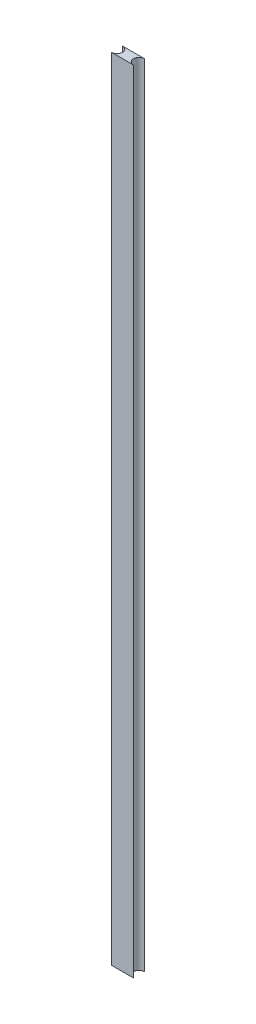
ISO-10303-21;
HEADER;
FILE_DESCRIPTION(('STEP AP214'),'2;1');
FILE_NAME('part.step','',(''),(''),'','','');
FILE_SCHEMA(('AUTOMOTIVE_DESIGN { 1 0 10303 214 1 1 1 1 }'));
ENDSEC;
DATA;
#1=APPLICATION_CONTEXT('core data for automotive mechanical design processes');
#2=APPLICATION_PROTOCOL_DEFINITION('international standard','automotive_design',2000,#1);
#3=PRODUCT_CONTEXT('',#1,'mechanical');
#4=PRODUCT('Part','Part','',(#3));
#5=PRODUCT_RELATED_PRODUCT_CATEGORY('part','',(#4));
#6=PRODUCT_DEFINITION_FORMATION('','',#4);
#7=PRODUCT_DEFINITION_CONTEXT('part definition',#1,'design');
#8=PRODUCT_DEFINITION('design','',#6,#7);
#9=PRODUCT_DEFINITION_SHAPE('','',#8);
#10=(LENGTH_UNIT() NAMED_UNIT(*) SI_UNIT(.MILLI.,.METRE.));
#11=(NAMED_UNIT(*) PLANE_ANGLE_UNIT() SI_UNIT($,.RADIAN.));
#12=(NAMED_UNIT(*) SI_UNIT($,.STERADIAN.) SOLID_ANGLE_UNIT());
#13=UNCERTAINTY_MEASURE_WITH_UNIT(LENGTH_MEASURE(1.E-05),#10,'distance_accuracy_value','');
#14=(GEOMETRIC_REPRESENTATION_CONTEXT(3) GLOBAL_UNCERTAINTY_ASSIGNED_CONTEXT((#13)) GLOBAL_UNIT_ASSIGNED_CONTEXT((#10,
#11,#12)) REPRESENTATION_CONTEXT('',''));
#15=CARTESIAN_POINT('',(0.,0.,0.));
#16=DIRECTION('',(0.,0.,1.));
#17=DIRECTION('',(1.,0.,0.));
#18=AXIS2_PLACEMENT_3D('',#15,#16,#17);
#19=CARTESIAN_POINT('',(-44.5716872313853,1800.,204.139724876424));
#20=DIRECTION('',(0.,-1.,0.));
#21=DIRECTION('',(0.,0.,-1.));
#22=AXIS2_PLACEMENT_3D('',#19,#20,#21);
#23=CYLINDRICAL_SURFACE('',#22,12.5);
#24=CARTESIAN_POINT('',(-44.5716872313853,0.,204.139724876424));
#25=DIRECTION('',(0.,-1.,0.));
#26=DIRECTION('',(0.,0.,1.));
#27=AXIS2_PLACEMENT_3D('',#24,#25,#26);
#28=CIRCLE('',#27,12.5);
#29=CARTESIAN_POINT('',(-44.5716872313853,0.,191.639724876424));
#30=VERTEX_POINT('',#29);
#31=CARTESIAN_POINT('',(-44.5716872313853,0.,216.639724876423));
#32=VERTEX_POINT('',#31);
#33=EDGE_CURVE('E96',#30,#32,#28,.T.);
#34=ORIENTED_EDGE('',*,*,#33,.T.);
#35=DIRECTION('',(0.,-1.,0.));
#36=VECTOR('',#35,1.);
#37=CARTESIAN_POINT('',(-44.5716872313853,1800.,216.639724876423));
#38=LINE('',#37,#36);
#39=CARTESIAN_POINT('',(-44.5716872313853,1800.,216.639724876423));
#40=VERTEX_POINT('',#39);
#41=EDGE_CURVE('E11',#40,#32,#38,.T.);
#42=ORIENTED_EDGE('',*,*,#41,.F.);
#43=CARTESIAN_POINT('',(-44.5716872313853,1800.,204.139724876424));
#44=DIRECTION('',(0.,-1.,0.));
#45=DIRECTION('',(0.,0.,1.));
#46=AXIS2_PLACEMENT_3D('',#43,#44,#45);
#47=CIRCLE('',#46,12.5);
#48=CARTESIAN_POINT('',(-44.5716872313853,1800.,191.639724876424));
#49=VERTEX_POINT('',#48);
#50=EDGE_CURVE('E84',#49,#40,#47,.T.);
#51=ORIENTED_EDGE('',*,*,#50,.F.);
#52=DIRECTION('',(0.,-1.,0.));
#53=VECTOR('',#52,1.);
#54=CARTESIAN_POINT('',(-44.5716872313853,1800.,191.639724876424));
#55=LINE('',#54,#53);
#56=EDGE_CURVE('E92',#49,#30,#55,.T.);
#57=ORIENTED_EDGE('',*,*,#56,.T.);
#58=EDGE_LOOP('',(#34,#42,#51,#57));
#59=FACE_BOUND('',#58,.T.);
#60=ADVANCED_FACE('F33',(#59),#23,.F.);
#61=CARTESIAN_POINT('',(-44.5716872313853,1800.,216.639724876423));
#62=DIRECTION('',(0.,0.,-1.));
#63=DIRECTION('',(-1.,0.,0.));
#64=AXIS2_PLACEMENT_3D('',#61,#62,#63);
#65=PLANE('',#64);
#66=DIRECTION('',(1.,0.,0.));
#67=VECTOR('',#66,1.);
#68=CARTESIAN_POINT('',(-44.5716872313853,0.,216.639724876423));
#69=LINE('',#68,#67);
#70=CARTESIAN_POINT('',(5.42831276861472,0.,216.639724876424));
#71=VERTEX_POINT('',#70);
#72=EDGE_CURVE('E88',#32,#71,#69,.T.);
#73=ORIENTED_EDGE('',*,*,#72,.T.);
#74=DIRECTION('',(0.,-1.,0.));
#75=VECTOR('',#74,1.);
#76=CARTESIAN_POINT('',(5.42831276861472,1800.,216.639724876424));
#77=LINE('',#76,#75);
#78=CARTESIAN_POINT('',(5.42831276861472,1800.,216.639724876424));
#79=VERTEX_POINT('',#78);
#80=EDGE_CURVE('E41',#79,#71,#77,.T.);
#81=ORIENTED_EDGE('',*,*,#80,.F.);
#82=DIRECTION('',(1.,0.,0.));
#83=VECTOR('',#82,1.);
#84=CARTESIAN_POINT('',(-44.5716872313853,1800.,216.639724876423));
#85=LINE('',#84,#83);
#86=EDGE_CURVE('E79',#40,#79,#85,.T.);
#87=ORIENTED_EDGE('',*,*,#86,.F.);
#88=ORIENTED_EDGE('',*,*,#41,.T.);
#89=EDGE_LOOP('',(#73,#81,#87,#88));
#90=FACE_BOUND('',#89,.T.);
#91=ADVANCED_FACE('F87',(#90),#65,.F.);
#92=CARTESIAN_POINT('',(5.42831276861472,1800.,204.139724876424));
#93=DIRECTION('',(0.,-1.,0.));
#94=DIRECTION('',(0.,0.,-1.));
#95=AXIS2_PLACEMENT_3D('',#92,#93,#94);
#96=CYLINDRICAL_SURFACE('',#95,12.5);
#97=CARTESIAN_POINT('',(5.42831276861472,0.,204.139724876424));
#98=DIRECTION('',(0.,-1.,0.));
#99=DIRECTION('',(0.,0.,1.));
#100=AXIS2_PLACEMENT_3D('',#97,#98,#99);
#101=CIRCLE('',#100,12.5);
#102=CARTESIAN_POINT('',(5.42831276861471,0.,191.639724876424));
#103=VERTEX_POINT('',#102);
#104=EDGE_CURVE('E66',#71,#103,#101,.T.);
#105=ORIENTED_EDGE('',*,*,#104,.T.);
#106=DIRECTION('',(0.,-1.,0.));
#107=VECTOR('',#106,1.);
#108=CARTESIAN_POINT('',(5.42831276861471,1800.,191.639724876424));
#109=LINE('',#108,#107);
#110=CARTESIAN_POINT('',(5.42831276861471,1800.,191.639724876424));
#111=VERTEX_POINT('',#110);
#112=EDGE_CURVE('E89',#111,#103,#109,.T.);
#113=ORIENTED_EDGE('',*,*,#112,.F.);
#114=CARTESIAN_POINT('',(5.42831276861472,1800.,204.139724876424));
#115=DIRECTION('',(0.,-1.,0.));
#116=DIRECTION('',(0.,0.,1.));
#117=AXIS2_PLACEMENT_3D('',#114,#115,#116);
#118=CIRCLE('',#117,12.5);
#119=EDGE_CURVE('E82',#79,#111,#118,.T.);
#120=ORIENTED_EDGE('',*,*,#119,.F.);
#121=ORIENTED_EDGE('',*,*,#80,.T.);
#122=EDGE_LOOP('',(#105,#113,#120,#121));
#123=FACE_BOUND('',#122,.T.);
#124=ADVANCED_FACE('F90',(#123),#96,.F.);
#125=CARTESIAN_POINT('',(-44.5716872313853,1800.,191.639724876424));
#126=DIRECTION('',(0.,0.,1.));
#127=DIRECTION('',(1.,0.,0.));
#128=AXIS2_PLACEMENT_3D('',#125,#126,#127);
#129=PLANE('',#128);
#130=DIRECTION('',(-1.,0.,0.));
#131=VECTOR('',#130,1.);
#132=CARTESIAN_POINT('',(-44.5716872313853,0.,191.639724876424));
#133=LINE('',#132,#131);
#134=EDGE_CURVE('E72',#103,#30,#133,.T.);
#135=ORIENTED_EDGE('',*,*,#134,.T.);
#136=ORIENTED_EDGE('',*,*,#56,.F.);
#137=DIRECTION('',(-1.,0.,0.));
#138=VECTOR('',#137,1.);
#139=CARTESIAN_POINT('',(-44.5716872313853,1800.,191.639724876424));
#140=LINE('',#139,#138);
#141=EDGE_CURVE('E49',#111,#49,#140,.T.);
#142=ORIENTED_EDGE('',*,*,#141,.F.);
#143=ORIENTED_EDGE('',*,*,#112,.T.);
#144=EDGE_LOOP('',(#135,#136,#142,#143));
#145=FACE_BOUND('',#144,.T.);
#146=ADVANCED_FACE('F103',(#145),#129,.F.);
#147=CARTESIAN_POINT('',(-44.5716872313853,1800.,204.139724876424));
#148=DIRECTION('',(0.,1.,0.));
#149=DIRECTION('',(0.,0.,1.));
#150=AXIS2_PLACEMENT_3D('',#147,#148,#149);
#151=PLANE('',#150);
#152=ORIENTED_EDGE('',*,*,#50,.T.);
#153=ORIENTED_EDGE('',*,*,#86,.T.);
#154=ORIENTED_EDGE('',*,*,#119,.T.);
#155=ORIENTED_EDGE('',*,*,#141,.T.);
#156=EDGE_LOOP('',(#152,#153,#154,#155));
#157=FACE_BOUND('',#156,.T.);
#158=ADVANCED_FACE('F80',(#157),#151,.T.);
#159=CARTESIAN_POINT('',(-44.5716872313853,0.,204.139724876424));
#160=DIRECTION('',(0.,1.,0.));
#161=DIRECTION('',(0.,0.,1.));
#162=AXIS2_PLACEMENT_3D('',#159,#160,#161);
#163=PLANE('',#162);
#164=ORIENTED_EDGE('',*,*,#33,.F.);
#165=ORIENTED_EDGE('',*,*,#134,.F.);
#166=ORIENTED_EDGE('',*,*,#104,.F.);
#167=ORIENTED_EDGE('',*,*,#72,.F.);
#168=EDGE_LOOP('',(#164,#165,#166,#167));
#169=FACE_BOUND('',#168,.T.);
#170=ADVANCED_FACE('F106',(#169),#163,.F.);
#171=CLOSED_SHELL('',(#60,#91,#124,#146,#158,#170));
#172=MANIFOLD_SOLID_BREP('B2',#171);
#173=ADVANCED_BREP_SHAPE_REPRESENTATION('',(#18,#172),#14);
#174=SHAPE_DEFINITION_REPRESENTATION(#9,#173);
ENDSEC;
END-ISO-10303-21;
